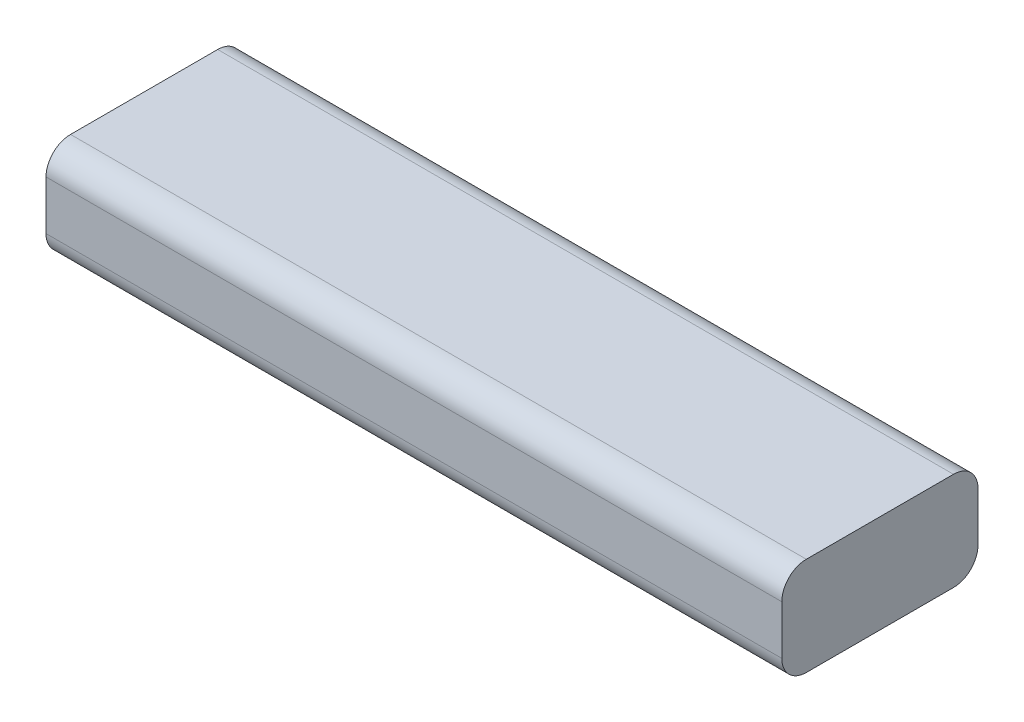
ISO-10303-21;
HEADER;
FILE_DESCRIPTION(('STEP AP214'),'2;1');
FILE_NAME('part.step','',(''),(''),'','','');
FILE_SCHEMA(('AUTOMOTIVE_DESIGN { 1 0 10303 214 1 1 1 1 }'));
ENDSEC;
DATA;
#1=APPLICATION_CONTEXT('core data for automotive mechanical design processes');
#2=APPLICATION_PROTOCOL_DEFINITION('international standard','automotive_design',2000,#1);
#3=PRODUCT_CONTEXT('',#1,'mechanical');
#4=PRODUCT('Part','Part','',(#3));
#5=PRODUCT_RELATED_PRODUCT_CATEGORY('part','',(#4));
#6=PRODUCT_DEFINITION_FORMATION('','',#4);
#7=PRODUCT_DEFINITION_CONTEXT('part definition',#1,'design');
#8=PRODUCT_DEFINITION('design','',#6,#7);
#9=PRODUCT_DEFINITION_SHAPE('','',#8);
#10=(LENGTH_UNIT() NAMED_UNIT(*) SI_UNIT(.MILLI.,.METRE.));
#11=(NAMED_UNIT(*) PLANE_ANGLE_UNIT() SI_UNIT($,.RADIAN.));
#12=(NAMED_UNIT(*) SI_UNIT($,.STERADIAN.) SOLID_ANGLE_UNIT());
#13=UNCERTAINTY_MEASURE_WITH_UNIT(LENGTH_MEASURE(1.E-05),#10,'distance_accuracy_value','');
#14=(GEOMETRIC_REPRESENTATION_CONTEXT(3) GLOBAL_UNCERTAINTY_ASSIGNED_CONTEXT((#13)) GLOBAL_UNIT_ASSIGNED_CONTEXT((#10,
#11,#12)) REPRESENTATION_CONTEXT('',''));
#15=CARTESIAN_POINT('',(0.,0.,0.));
#16=DIRECTION('',(0.,0.,1.));
#17=DIRECTION('',(1.,0.,0.));
#18=AXIS2_PLACEMENT_3D('',#15,#16,#17);
#19=CARTESIAN_POINT('',(70.,6.,-15.));
#20=DIRECTION('',(1.,0.,0.));
#21=DIRECTION('',(0.,0.,-1.));
#22=AXIS2_PLACEMENT_3D('',#19,#20,#21);
#23=PLANE('',#22);
#24=DIRECTION('',(0.,0.,1.));
#25=VECTOR('',#24,1.);
#26=CARTESIAN_POINT('',(70.,0.999999999999999,-15.));
#27=LINE('',#26,#25);
#28=CARTESIAN_POINT('',(70.,0.999999999999999,-15.));
#29=VERTEX_POINT('',#28);
#30=CARTESIAN_POINT('',(70.,0.999999999999999,15.));
#31=VERTEX_POINT('',#30);
#32=EDGE_CURVE('E138',#29,#31,#27,.T.);
#33=ORIENTED_EDGE('',*,*,#32,.T.);
#34=DIRECTION('',(0.,-1.,0.));
#35=VECTOR('',#34,1.);
#36=CARTESIAN_POINT('',(70.,6.,15.));
#37=LINE('',#36,#35);
#38=CARTESIAN_POINT('',(70.,6.,15.));
#39=VERTEX_POINT('',#38);
#40=EDGE_CURVE('E132',#39,#31,#37,.T.);
#41=ORIENTED_EDGE('',*,*,#40,.F.);
#42=DIRECTION('',(0.,0.,1.));
#43=VECTOR('',#42,1.);
#44=CARTESIAN_POINT('',(70.,6.,-15.));
#45=LINE('',#44,#43);
#46=CARTESIAN_POINT('',(70.,6.,-15.));
#47=VERTEX_POINT('',#46);
#48=EDGE_CURVE('E135',#47,#39,#45,.T.);
#49=ORIENTED_EDGE('',*,*,#48,.F.);
#50=DIRECTION('',(0.,-1.,0.));
#51=VECTOR('',#50,1.);
#52=CARTESIAN_POINT('',(70.,6.,-15.));
#53=LINE('',#52,#51);
#54=EDGE_CURVE('E181',#47,#29,#53,.T.);
#55=ORIENTED_EDGE('',*,*,#54,.T.);
#56=EDGE_LOOP('',(#33,#41,#49,#55));
#57=FACE_BOUND('',#56,.T.);
#58=ADVANCED_FACE('F39',(#57),#23,.F.);
#59=CARTESIAN_POINT('',(70.,6.,-15.));
#60=DIRECTION('',(0.,0.,-1.));
#61=DIRECTION('',(-1.,0.,0.));
#62=AXIS2_PLACEMENT_3D('',#59,#60,#61);
#63=PLANE('',#62);
#64=DIRECTION('',(1.,0.,0.));
#65=VECTOR('',#64,1.);
#66=CARTESIAN_POINT('',(70.,0.999999999999999,-15.));
#67=LINE('',#66,#65);
#68=CARTESIAN_POINT('',(40.,0.999999999999999,-15.));
#69=VERTEX_POINT('',#68);
#70=EDGE_CURVE('E158',#69,#29,#67,.T.);
#71=ORIENTED_EDGE('',*,*,#70,.T.);
#72=ORIENTED_EDGE('',*,*,#54,.F.);
#73=DIRECTION('',(1.,0.,0.));
#74=VECTOR('',#73,1.);
#75=CARTESIAN_POINT('',(70.,6.,-15.));
#76=LINE('',#75,#74);
#77=CARTESIAN_POINT('',(40.,6.,-15.));
#78=VERTEX_POINT('',#77);
#79=EDGE_CURVE('E144',#78,#47,#76,.T.);
#80=ORIENTED_EDGE('',*,*,#79,.F.);
#81=DIRECTION('',(0.,-1.,0.));
#82=VECTOR('',#81,1.);
#83=CARTESIAN_POINT('',(40.,6.,-15.));
#84=LINE('',#83,#82);
#85=EDGE_CURVE('E185',#78,#69,#84,.T.);
#86=ORIENTED_EDGE('',*,*,#85,.T.);
#87=EDGE_LOOP('',(#71,#72,#80,#86));
#88=FACE_BOUND('',#87,.T.);
#89=ADVANCED_FACE('F309',(#88),#63,.F.);
#90=CARTESIAN_POINT('',(40.,6.,-15.));
#91=DIRECTION('',(-1.,0.,0.));
#92=DIRECTION('',(0.,0.,1.));
#93=AXIS2_PLACEMENT_3D('',#90,#91,#92);
#94=PLANE('',#93);
#95=CARTESIAN_POINT('',(40.,3.5,12.));
#96=DIRECTION('',(-1.,0.,0.));
#97=DIRECTION('',(0.,0.,1.));
#98=AXIS2_PLACEMENT_3D('',#95,#96,#97);
#99=CIRCLE('',#98,2.);
#100=CARTESIAN_POINT('',(40.,3.5,14.));
#101=VERTEX_POINT('',#100);
#102=EDGE_CURVE('E175',#101,#101,#99,.T.);
#103=ORIENTED_EDGE('',*,*,#102,.T.);
#104=EDGE_LOOP('',(#103));
#105=FACE_BOUND('',#104,.T.);
#106=DIRECTION('',(0.,0.,-1.));
#107=VECTOR('',#106,1.);
#108=CARTESIAN_POINT('',(40.,0.999999999999999,-15.));
#109=LINE('',#108,#107);
#110=CARTESIAN_POINT('',(40.,0.999999999999999,15.));
#111=VERTEX_POINT('',#110);
#112=EDGE_CURVE('E162',#111,#69,#109,.T.);
#113=ORIENTED_EDGE('',*,*,#112,.T.);
#114=ORIENTED_EDGE('',*,*,#85,.F.);
#115=DIRECTION('',(0.,0.,-1.));
#116=VECTOR('',#115,1.);
#117=CARTESIAN_POINT('',(40.,6.,-15.));
#118=LINE('',#117,#116);
#119=CARTESIAN_POINT('',(40.,6.,15.));
#120=VERTEX_POINT('',#119);
#121=EDGE_CURVE('E153',#120,#78,#118,.T.);
#122=ORIENTED_EDGE('',*,*,#121,.F.);
#123=DIRECTION('',(0.,-1.,0.));
#124=VECTOR('',#123,1.);
#125=CARTESIAN_POINT('',(40.,6.,15.));
#126=LINE('',#125,#124);
#127=EDGE_CURVE('E143',#120,#111,#126,.T.);
#128=ORIENTED_EDGE('',*,*,#127,.T.);
#129=EDGE_LOOP('',(#113,#114,#122,#128));
#130=FACE_BOUND('',#129,.T.);
#131=ADVANCED_FACE('F314',(#105,#130),#94,.F.);
#132=CARTESIAN_POINT('',(70.,6.,15.));
#133=DIRECTION('',(0.,0.,1.));
#134=DIRECTION('',(1.,0.,0.));
#135=AXIS2_PLACEMENT_3D('',#132,#133,#134);
#136=PLANE('',#135);
#137=DIRECTION('',(-1.,0.,0.));
#138=VECTOR('',#137,1.);
#139=CARTESIAN_POINT('',(70.,0.999999999999999,15.));
#140=LINE('',#139,#138);
#141=EDGE_CURVE('E174',#31,#111,#140,.T.);
#142=ORIENTED_EDGE('',*,*,#141,.T.);
#143=ORIENTED_EDGE('',*,*,#127,.F.);
#144=DIRECTION('',(-1.,0.,0.));
#145=VECTOR('',#144,1.);
#146=CARTESIAN_POINT('',(70.,6.,15.));
#147=LINE('',#146,#145);
#148=EDGE_CURVE('E147',#39,#120,#147,.T.);
#149=ORIENTED_EDGE('',*,*,#148,.F.);
#150=ORIENTED_EDGE('',*,*,#40,.T.);
#151=EDGE_LOOP('',(#142,#143,#149,#150));
#152=FACE_BOUND('',#151,.T.);
#153=ADVANCED_FACE('F148',(#152),#136,.F.);
#154=CARTESIAN_POINT('',(0.,6.,0.));
#155=DIRECTION('',(0.,-1.,0.));
#156=DIRECTION('',(0.,0.,-1.));
#157=AXIS2_PLACEMENT_3D('',#154,#155,#156);
#158=PLANE('',#157);
#159=ORIENTED_EDGE('',*,*,#48,.T.);
#160=ORIENTED_EDGE('',*,*,#148,.T.);
#161=ORIENTED_EDGE('',*,*,#121,.T.);
#162=ORIENTED_EDGE('',*,*,#79,.T.);
#163=EDGE_LOOP('',(#159,#160,#161,#162));
#164=FACE_BOUND('',#163,.T.);
#165=ADVANCED_FACE('F155',(#164),#158,.T.);
#166=CARTESIAN_POINT('',(0.,0.999999999999999,0.));
#167=DIRECTION('',(0.,-1.,0.));
#168=DIRECTION('',(0.,0.,-1.));
#169=AXIS2_PLACEMENT_3D('',#166,#167,#168);
#170=PLANE('',#169);
#171=ORIENTED_EDGE('',*,*,#32,.F.);
#172=ORIENTED_EDGE('',*,*,#70,.F.);
#173=ORIENTED_EDGE('',*,*,#112,.F.);
#174=ORIENTED_EDGE('',*,*,#141,.F.);
#175=EDGE_LOOP('',(#171,#172,#173,#174));
#176=FACE_BOUND('',#175,.T.);
#177=ADVANCED_FACE('F360',(#176),#170,.F.);
#178=CARTESIAN_POINT('',(65.,3.5,12.));
#179=DIRECTION('',(-1.,0.,0.));
#180=DIRECTION('',(0.,0.,1.));
#181=AXIS2_PLACEMENT_3D('',#178,#179,#180);
#182=CYLINDRICAL_SURFACE('',#181,2.);
#183=CARTESIAN_POINT('',(-75.,3.5,12.));
#184=DIRECTION('',(-1.,0.,0.));
#185=DIRECTION('',(0.,0.,1.));
#186=AXIS2_PLACEMENT_3D('',#183,#184,#185);
#187=CIRCLE('',#186,2.);
#188=CARTESIAN_POINT('',(-75.,3.5,14.));
#189=VERTEX_POINT('',#188);
#190=EDGE_CURVE('E165',#189,#189,#187,.T.);
#191=ORIENTED_EDGE('',*,*,#190,.T.);
#192=EDGE_LOOP('',(#191));
#193=FACE_BOUND('',#192,.T.);
#194=ORIENTED_EDGE('',*,*,#102,.F.);
#195=EDGE_LOOP('',(#194));
#196=FACE_BOUND('',#195,.T.);
#197=ADVANCED_FACE('F357',(#193,#196),#182,.F.);
#198=CARTESIAN_POINT('',(-75.,20.,-20.));
#199=DIRECTION('',(1.,0.,0.));
#200=DIRECTION('',(0.,0.,-1.));
#201=AXIS2_PLACEMENT_3D('',#198,#199,#200);
#202=PLANE('',#201);
#203=CARTESIAN_POINT('',(-75.,10.,0.));
#204=DIRECTION('',(-1.,0.,0.));
#205=DIRECTION('',(0.,0.,1.));
#206=AXIS2_PLACEMENT_3D('',#203,#204,#205);
#207=CIRCLE('',#206,2.);
#208=CARTESIAN_POINT('',(-75.,10.,2.00000000000002));
#209=VERTEX_POINT('',#208);
#210=EDGE_CURVE('E491',#209,#209,#207,.T.);
#211=ORIENTED_EDGE('',*,*,#210,.F.);
#212=EDGE_LOOP('',(#211));
#213=FACE_BOUND('',#212,.T.);
#214=ORIENTED_EDGE('',*,*,#190,.F.);
#215=EDGE_LOOP('',(#214));
#216=FACE_BOUND('',#215,.T.);
#217=DIRECTION('',(0.,-1.,0.));
#218=VECTOR('',#217,1.);
#219=CARTESIAN_POINT('',(-75.,20.,-20.));
#220=LINE('',#219,#218);
#221=CARTESIAN_POINT('',(-75.,15.,-20.));
#222=VERTEX_POINT('',#221);
#223=CARTESIAN_POINT('',(-75.,5.,-20.));
#224=VERTEX_POINT('',#223);
#225=EDGE_CURVE('E199',#222,#224,#220,.T.);
#226=ORIENTED_EDGE('',*,*,#225,.T.);
#227=CARTESIAN_POINT('',(-75.,5.,-15.));
#228=DIRECTION('',(1.,0.,0.));
#229=DIRECTION('',(0.,0.,-1.));
#230=AXIS2_PLACEMENT_3D('',#227,#228,#229);
#231=CIRCLE('',#230,5.);
#232=CARTESIAN_POINT('',(-75.,0.,-15.));
#233=VERTEX_POINT('',#232);
#234=EDGE_CURVE('E239',#224,#233,#231,.F.);
#235=ORIENTED_EDGE('',*,*,#234,.T.);
#236=DIRECTION('',(0.,0.,1.));
#237=VECTOR('',#236,1.);
#238=CARTESIAN_POINT('',(-75.,0.,-20.));
#239=LINE('',#238,#237);
#240=CARTESIAN_POINT('',(-75.,0.,15.));
#241=VERTEX_POINT('',#240);
#242=EDGE_CURVE('E184',#233,#241,#239,.T.);
#243=ORIENTED_EDGE('',*,*,#242,.T.);
#244=CARTESIAN_POINT('',(-75.,5.,15.));
#245=DIRECTION('',(1.,0.,0.));
#246=DIRECTION('',(0.,0.,-1.));
#247=AXIS2_PLACEMENT_3D('',#244,#245,#246);
#248=CIRCLE('',#247,5.);
#249=CARTESIAN_POINT('',(-75.,5.,20.));
#250=VERTEX_POINT('',#249);
#251=EDGE_CURVE('E236',#241,#250,#248,.F.);
#252=ORIENTED_EDGE('',*,*,#251,.T.);
#253=DIRECTION('',(0.,-1.,0.));
#254=VECTOR('',#253,1.);
#255=CARTESIAN_POINT('',(-75.,20.,20.));
#256=LINE('',#255,#254);
#257=CARTESIAN_POINT('',(-75.,15.,20.));
#258=VERTEX_POINT('',#257);
#259=EDGE_CURVE('E216',#258,#250,#256,.T.);
#260=ORIENTED_EDGE('',*,*,#259,.F.);
#261=CARTESIAN_POINT('',(-75.,15.,15.));
#262=DIRECTION('',(1.,0.,0.));
#263=DIRECTION('',(0.,0.,-1.));
#264=AXIS2_PLACEMENT_3D('',#261,#262,#263);
#265=CIRCLE('',#264,5.);
#266=CARTESIAN_POINT('',(-75.,20.,15.));
#267=VERTEX_POINT('',#266);
#268=EDGE_CURVE('E230',#258,#267,#265,.F.);
#269=ORIENTED_EDGE('',*,*,#268,.T.);
#270=DIRECTION('',(0.,0.,1.));
#271=VECTOR('',#270,1.);
#272=CARTESIAN_POINT('',(-75.,20.,-20.));
#273=LINE('',#272,#271);
#274=CARTESIAN_POINT('',(-75.,20.,-15.));
#275=VERTEX_POINT('',#274);
#276=EDGE_CURVE('E190',#275,#267,#273,.T.);
#277=ORIENTED_EDGE('',*,*,#276,.F.);
#278=CARTESIAN_POINT('',(-75.,15.,-15.));
#279=DIRECTION('',(1.,0.,0.));
#280=DIRECTION('',(0.,0.,-1.));
#281=AXIS2_PLACEMENT_3D('',#278,#279,#280);
#282=CIRCLE('',#281,5.);
#283=EDGE_CURVE('E233',#275,#222,#282,.F.);
#284=ORIENTED_EDGE('',*,*,#283,.T.);
#285=EDGE_LOOP('',(#226,#235,#243,#252,#260,#269,#277,#284));
#286=FACE_BOUND('',#285,.T.);
#287=ADVANCED_FACE('F280',(#213,#216,#286),#202,.F.);
#288=CARTESIAN_POINT('',(-75.,20.,20.));
#289=DIRECTION('',(0.,0.,-1.));
#290=DIRECTION('',(-1.,0.,0.));
#291=AXIS2_PLACEMENT_3D('',#288,#289,#290);
#292=PLANE('',#291);
#293=ORIENTED_EDGE('',*,*,#259,.T.);
#294=DIRECTION('',(1.,0.,0.));
#295=VECTOR('',#294,1.);
#296=CARTESIAN_POINT('',(-75.,5.,20.));
#297=LINE('',#296,#295);
#298=CARTESIAN_POINT('',(75.,5.,20.));
#299=VERTEX_POINT('',#298);
#300=EDGE_CURVE('E261',#250,#299,#297,.T.);
#301=ORIENTED_EDGE('',*,*,#300,.T.);
#302=DIRECTION('',(0.,-1.,0.));
#303=VECTOR('',#302,1.);
#304=CARTESIAN_POINT('',(75.,20.,20.));
#305=LINE('',#304,#303);
#306=CARTESIAN_POINT('',(75.,15.,20.));
#307=VERTEX_POINT('',#306);
#308=EDGE_CURVE('E213',#307,#299,#305,.T.);
#309=ORIENTED_EDGE('',*,*,#308,.F.);
#310=DIRECTION('',(1.,0.,0.));
#311=VECTOR('',#310,1.);
#312=CARTESIAN_POINT('',(-75.,15.,20.));
#313=LINE('',#312,#311);
#314=EDGE_CURVE('E258',#307,#258,#313,.F.);
#315=ORIENTED_EDGE('',*,*,#314,.T.);
#316=EDGE_LOOP('',(#293,#301,#309,#315));
#317=FACE_BOUND('',#316,.T.);
#318=ADVANCED_FACE('F285',(#317),#292,.F.);
#319=CARTESIAN_POINT('',(75.,20.,-20.));
#320=DIRECTION('',(-1.,0.,0.));
#321=DIRECTION('',(0.,0.,1.));
#322=AXIS2_PLACEMENT_3D('',#319,#320,#321);
#323=PLANE('',#322);
#324=DIRECTION('',(0.,0.,-1.));
#325=VECTOR('',#324,1.);
#326=CARTESIAN_POINT('',(75.,0.,-20.));
#327=LINE('',#326,#325);
#328=CARTESIAN_POINT('',(75.,0.,15.));
#329=VERTEX_POINT('',#328);
#330=CARTESIAN_POINT('',(75.,0.,-15.));
#331=VERTEX_POINT('',#330);
#332=EDGE_CURVE('E195',#329,#331,#327,.T.);
#333=ORIENTED_EDGE('',*,*,#332,.T.);
#334=CARTESIAN_POINT('',(75.,5.,-15.));
#335=DIRECTION('',(-1.,0.,0.));
#336=DIRECTION('',(0.,0.,1.));
#337=AXIS2_PLACEMENT_3D('',#334,#335,#336);
#338=CIRCLE('',#337,5.);
#339=CARTESIAN_POINT('',(75.,5.,-20.));
#340=VERTEX_POINT('',#339);
#341=EDGE_CURVE('E255',#331,#340,#338,.F.);
#342=ORIENTED_EDGE('',*,*,#341,.T.);
#343=DIRECTION('',(0.,-1.,0.));
#344=VECTOR('',#343,1.);
#345=CARTESIAN_POINT('',(75.,20.,-20.));
#346=LINE('',#345,#344);
#347=CARTESIAN_POINT('',(75.,15.,-20.));
#348=VERTEX_POINT('',#347);
#349=EDGE_CURVE('E209',#348,#340,#346,.T.);
#350=ORIENTED_EDGE('',*,*,#349,.F.);
#351=CARTESIAN_POINT('',(75.,15.,-15.));
#352=DIRECTION('',(-1.,0.,0.));
#353=DIRECTION('',(0.,0.,1.));
#354=AXIS2_PLACEMENT_3D('',#351,#352,#353);
#355=CIRCLE('',#354,5.);
#356=CARTESIAN_POINT('',(75.,20.,-15.));
#357=VERTEX_POINT('',#356);
#358=EDGE_CURVE('E250',#348,#357,#355,.F.);
#359=ORIENTED_EDGE('',*,*,#358,.T.);
#360=DIRECTION('',(0.,0.,-1.));
#361=VECTOR('',#360,1.);
#362=CARTESIAN_POINT('',(75.,20.,-20.));
#363=LINE('',#362,#361);
#364=CARTESIAN_POINT('',(75.,20.,15.));
#365=VERTEX_POINT('',#364);
#366=EDGE_CURVE('E194',#365,#357,#363,.T.);
#367=ORIENTED_EDGE('',*,*,#366,.F.);
#368=CARTESIAN_POINT('',(75.,15.,15.));
#369=DIRECTION('',(-1.,0.,0.));
#370=DIRECTION('',(0.,0.,1.));
#371=AXIS2_PLACEMENT_3D('',#368,#369,#370);
#372=CIRCLE('',#371,5.);
#373=EDGE_CURVE('E64',#365,#307,#372,.F.);
#374=ORIENTED_EDGE('',*,*,#373,.T.);
#375=ORIENTED_EDGE('',*,*,#308,.T.);
#376=CARTESIAN_POINT('',(75.,5.,15.));
#377=DIRECTION('',(-1.,0.,0.));
#378=DIRECTION('',(0.,0.,1.));
#379=AXIS2_PLACEMENT_3D('',#376,#377,#378);
#380=CIRCLE('',#379,5.);
#381=EDGE_CURVE('E56',#299,#329,#380,.F.);
#382=ORIENTED_EDGE('',*,*,#381,.T.);
#383=EDGE_LOOP('',(#333,#342,#350,#359,#367,#374,#375,#382));
#384=FACE_BOUND('',#383,.T.);
#385=ADVANCED_FACE('F273',(#384),#323,.F.);
#386=CARTESIAN_POINT('',(-75.,20.,-20.));
#387=DIRECTION('',(0.,0.,1.));
#388=DIRECTION('',(1.,0.,0.));
#389=AXIS2_PLACEMENT_3D('',#386,#387,#388);
#390=PLANE('',#389);
#391=ORIENTED_EDGE('',*,*,#349,.T.);
#392=DIRECTION('',(-1.,0.,0.));
#393=VECTOR('',#392,1.);
#394=CARTESIAN_POINT('',(-75.,5.,-20.));
#395=LINE('',#394,#393);
#396=EDGE_CURVE('E226',#340,#224,#395,.T.);
#397=ORIENTED_EDGE('',*,*,#396,.T.);
#398=ORIENTED_EDGE('',*,*,#225,.F.);
#399=DIRECTION('',(-1.,0.,0.));
#400=VECTOR('',#399,1.);
#401=CARTESIAN_POINT('',(75.,15.,-20.));
#402=LINE('',#401,#400);
#403=EDGE_CURVE('E220',#222,#348,#402,.F.);
#404=ORIENTED_EDGE('',*,*,#403,.T.);
#405=EDGE_LOOP('',(#391,#397,#398,#404));
#406=FACE_BOUND('',#405,.T.);
#407=ADVANCED_FACE('F298',(#406),#390,.F.);
#408=CARTESIAN_POINT('',(0.,20.,0.));
#409=DIRECTION('',(0.,1.,0.));
#410=DIRECTION('',(0.,0.,1.));
#411=AXIS2_PLACEMENT_3D('',#408,#409,#410);
#412=PLANE('',#411);
#413=ORIENTED_EDGE('',*,*,#366,.T.);
#414=DIRECTION('',(-1.,0.,0.));
#415=VECTOR('',#414,1.);
#416=CARTESIAN_POINT('',(-75.,20.,-15.));
#417=LINE('',#416,#415);
#418=EDGE_CURVE('E11',#357,#275,#417,.T.);
#419=ORIENTED_EDGE('',*,*,#418,.T.);
#420=ORIENTED_EDGE('',*,*,#276,.T.);
#421=DIRECTION('',(1.,0.,0.));
#422=VECTOR('',#421,1.);
#423=CARTESIAN_POINT('',(75.,20.,15.));
#424=LINE('',#423,#422);
#425=EDGE_CURVE('E49',#267,#365,#424,.T.);
#426=ORIENTED_EDGE('',*,*,#425,.T.);
#427=EDGE_LOOP('',(#413,#419,#420,#426));
#428=FACE_BOUND('',#427,.T.);
#429=ADVANCED_FACE('F268',(#428),#412,.T.);
#430=CARTESIAN_POINT('',(0.,0.,0.));
#431=DIRECTION('',(0.,1.,0.));
#432=DIRECTION('',(0.,0.,1.));
#433=AXIS2_PLACEMENT_3D('',#430,#431,#432);
#434=PLANE('',#433);
#435=ORIENTED_EDGE('',*,*,#242,.F.);
#436=DIRECTION('',(-1.,0.,0.));
#437=VECTOR('',#436,1.);
#438=CARTESIAN_POINT('',(0.,0.,-15.));
#439=LINE('',#438,#437);
#440=EDGE_CURVE('E245',#233,#331,#439,.F.);
#441=ORIENTED_EDGE('',*,*,#440,.T.);
#442=ORIENTED_EDGE('',*,*,#332,.F.);
#443=DIRECTION('',(1.,0.,0.));
#444=VECTOR('',#443,1.);
#445=CARTESIAN_POINT('',(0.,0.,15.));
#446=LINE('',#445,#444);
#447=EDGE_CURVE('E242',#329,#241,#446,.F.);
#448=ORIENTED_EDGE('',*,*,#447,.T.);
#449=EDGE_LOOP('',(#435,#441,#442,#448));
#450=FACE_BOUND('',#449,.T.);
#451=ADVANCED_FACE('F290',(#450),#434,.F.);
#452=CARTESIAN_POINT('',(-75.,5.,-15.));
#453=DIRECTION('',(-1.,0.,0.));
#454=DIRECTION('',(0.,0.,1.));
#455=AXIS2_PLACEMENT_3D('',#452,#453,#454);
#456=CYLINDRICAL_SURFACE('',#455,5.);
#457=ORIENTED_EDGE('',*,*,#341,.F.);
#458=ORIENTED_EDGE('',*,*,#440,.F.);
#459=ORIENTED_EDGE('',*,*,#234,.F.);
#460=ORIENTED_EDGE('',*,*,#396,.F.);
#461=EDGE_LOOP('',(#457,#458,#459,#460));
#462=FACE_BOUND('',#461,.T.);
#463=ADVANCED_FACE('F295',(#462),#456,.T.);
#464=CARTESIAN_POINT('',(-75.,5.,15.));
#465=DIRECTION('',(1.,0.,0.));
#466=DIRECTION('',(0.,0.,-1.));
#467=AXIS2_PLACEMENT_3D('',#464,#465,#466);
#468=CYLINDRICAL_SURFACE('',#467,5.);
#469=ORIENTED_EDGE('',*,*,#251,.F.);
#470=ORIENTED_EDGE('',*,*,#447,.F.);
#471=ORIENTED_EDGE('',*,*,#381,.F.);
#472=ORIENTED_EDGE('',*,*,#300,.F.);
#473=EDGE_LOOP('',(#469,#470,#471,#472));
#474=FACE_BOUND('',#473,.T.);
#475=ADVANCED_FACE('F293',(#474),#468,.T.);
#476=CARTESIAN_POINT('',(0.,15.,-15.));
#477=DIRECTION('',(1.,0.,0.));
#478=DIRECTION('',(0.,0.,-1.));
#479=AXIS2_PLACEMENT_3D('',#476,#477,#478);
#480=CYLINDRICAL_SURFACE('',#479,5.);
#481=ORIENTED_EDGE('',*,*,#358,.F.);
#482=ORIENTED_EDGE('',*,*,#403,.F.);
#483=ORIENTED_EDGE('',*,*,#283,.F.);
#484=ORIENTED_EDGE('',*,*,#418,.F.);
#485=EDGE_LOOP('',(#481,#482,#483,#484));
#486=FACE_BOUND('',#485,.T.);
#487=ADVANCED_FACE('F278',(#486),#480,.T.);
#488=CARTESIAN_POINT('',(0.,15.,15.));
#489=DIRECTION('',(-1.,0.,0.));
#490=DIRECTION('',(0.,0.,1.));
#491=AXIS2_PLACEMENT_3D('',#488,#489,#490);
#492=CYLINDRICAL_SURFACE('',#491,5.);
#493=ORIENTED_EDGE('',*,*,#268,.F.);
#494=ORIENTED_EDGE('',*,*,#314,.F.);
#495=ORIENTED_EDGE('',*,*,#373,.F.);
#496=ORIENTED_EDGE('',*,*,#425,.F.);
#497=EDGE_LOOP('',(#493,#494,#495,#496));
#498=FACE_BOUND('',#497,.T.);
#499=ADVANCED_FACE('F41',(#498),#492,.T.);
#500=CARTESIAN_POINT('',(-13.,10.,0.));
#501=DIRECTION('',(-1.,0.,0.));
#502=DIRECTION('',(0.,0.,1.));
#503=AXIS2_PLACEMENT_3D('',#500,#501,#502);
#504=CYLINDRICAL_SURFACE('',#503,2.);
#505=ORIENTED_EDGE('',*,*,#210,.T.);
#506=EDGE_LOOP('',(#505));
#507=FACE_BOUND('',#506,.T.);
#508=CARTESIAN_POINT('',(-50.,10.,0.));
#509=DIRECTION('',(-1.,0.,0.));
#510=DIRECTION('',(0.,0.,1.));
#511=AXIS2_PLACEMENT_3D('',#508,#509,#510);
#512=CIRCLE('',#511,2.);
#513=CARTESIAN_POINT('',(-50.,10.,2.00000000000002));
#514=VERTEX_POINT('',#513);
#515=EDGE_CURVE('E43',#514,#514,#512,.T.);
#516=ORIENTED_EDGE('',*,*,#515,.F.);
#517=EDGE_LOOP('',(#516));
#518=FACE_BOUND('',#517,.T.);
#519=ADVANCED_FACE('F334',(#507,#518),#504,.F.);
#520=CARTESIAN_POINT('',(0.,10.,0.));
#521=DIRECTION('',(-1.,0.,0.));
#522=DIRECTION('',(0.,0.,1.));
#523=AXIS2_PLACEMENT_3D('',#520,#521,#522);
#524=CYLINDRICAL_SURFACE('',#523,9.);
#525=CARTESIAN_POINT('',(0.,10.,0.));
#526=DIRECTION('',(-1.,0.,0.));
#527=DIRECTION('',(0.,0.,1.));
#528=AXIS2_PLACEMENT_3D('',#525,#526,#527);
#529=CIRCLE('',#528,9.);
#530=CARTESIAN_POINT('',(0.,10.,9.00000000000002));
#531=VERTEX_POINT('',#530);
#532=EDGE_CURVE('E495',#531,#531,#529,.T.);
#533=ORIENTED_EDGE('',*,*,#532,.F.);
#534=EDGE_LOOP('',(#533));
#535=FACE_BOUND('',#534,.T.);
#536=CARTESIAN_POINT('',(-50.,10.,0.));
#537=DIRECTION('',(-1.,0.,0.));
#538=DIRECTION('',(0.,0.,1.));
#539=AXIS2_PLACEMENT_3D('',#536,#537,#538);
#540=CIRCLE('',#539,9.);
#541=CARTESIAN_POINT('',(-50.,10.,9.00000000000002));
#542=VERTEX_POINT('',#541);
#543=EDGE_CURVE('E498',#542,#542,#540,.T.);
#544=ORIENTED_EDGE('',*,*,#543,.T.);
#545=EDGE_LOOP('',(#544));
#546=FACE_BOUND('',#545,.T.);
#547=ADVANCED_FACE('F338',(#535,#546),#524,.F.);
#548=CARTESIAN_POINT('',(0.,10.,0.));
#549=DIRECTION('',(-1.,0.,0.));
#550=DIRECTION('',(0.,0.,1.));
#551=AXIS2_PLACEMENT_3D('',#548,#549,#550);
#552=PLANE('',#551);
#553=ORIENTED_EDGE('',*,*,#532,.T.);
#554=EDGE_LOOP('',(#553));
#555=FACE_BOUND('',#554,.T.);
#556=ADVANCED_FACE('F344',(#555),#552,.T.);
#557=CARTESIAN_POINT('',(-50.,10.,0.));
#558=DIRECTION('',(-1.,0.,0.));
#559=DIRECTION('',(0.,0.,1.));
#560=AXIS2_PLACEMENT_3D('',#557,#558,#559);
#561=PLANE('',#560);
#562=ORIENTED_EDGE('',*,*,#515,.T.);
#563=EDGE_LOOP('',(#562));
#564=FACE_BOUND('',#563,.T.);
#565=ORIENTED_EDGE('',*,*,#543,.F.);
#566=EDGE_LOOP('',(#565));
#567=FACE_BOUND('',#566,.T.);
#568=ADVANCED_FACE('F352',(#564,#567),#561,.F.);
#569=CLOSED_SHELL('',(#58,#89,#131,#153,#165,#177,#197,#287,#318,#385,#407,#429,#451,#463,#475,
#487,#499,#519,#547,#556,#568));
#570=MANIFOLD_SOLID_BREP('B2',#569);
#571=ADVANCED_BREP_SHAPE_REPRESENTATION('',(#18,#570),#14);
#572=SHAPE_DEFINITION_REPRESENTATION(#9,#571);
ENDSEC;
END-ISO-10303-21;
